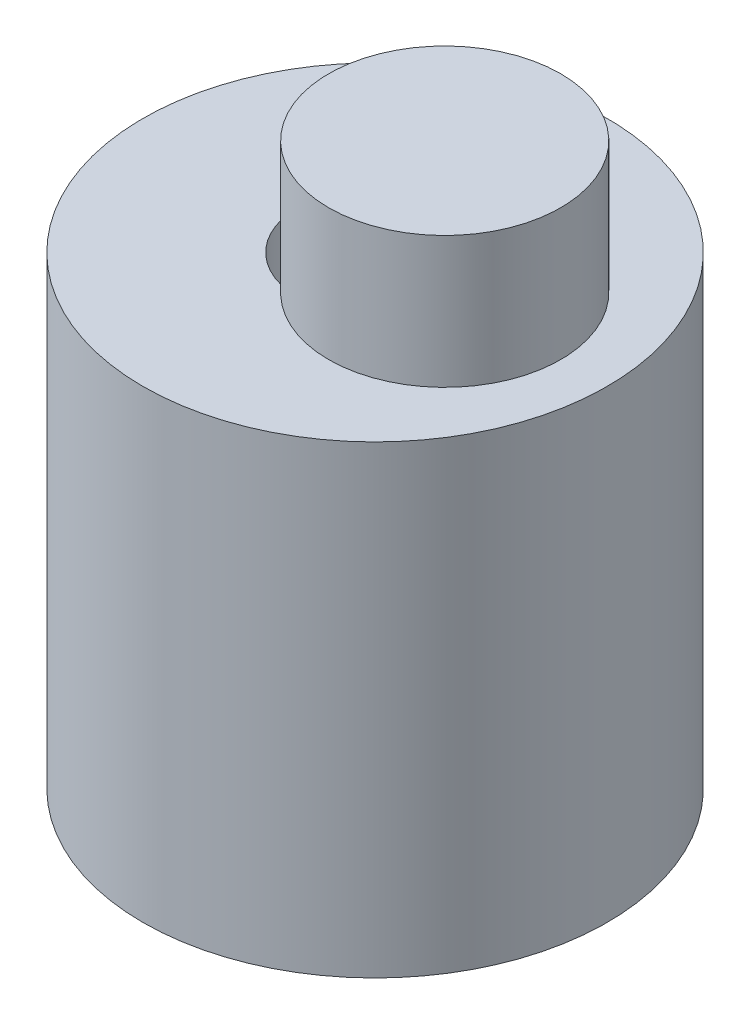
ISO-10303-21;
HEADER;
FILE_DESCRIPTION(('STEP AP214'),'2;1');
FILE_NAME('part.step','',(''),(''),'','','');
FILE_SCHEMA(('AUTOMOTIVE_DESIGN { 1 0 10303 214 1 1 1 1 }'));
ENDSEC;
DATA;
#1=APPLICATION_CONTEXT('core data for automotive mechanical design processes');
#2=APPLICATION_PROTOCOL_DEFINITION('international standard','automotive_design',2000,#1);
#3=PRODUCT_CONTEXT('',#1,'mechanical');
#4=PRODUCT('Part','Part','',(#3));
#5=PRODUCT_RELATED_PRODUCT_CATEGORY('part','',(#4));
#6=PRODUCT_DEFINITION_FORMATION('','',#4);
#7=PRODUCT_DEFINITION_CONTEXT('part definition',#1,'design');
#8=PRODUCT_DEFINITION('design','',#6,#7);
#9=PRODUCT_DEFINITION_SHAPE('','',#8);
#10=(LENGTH_UNIT() NAMED_UNIT(*) SI_UNIT(.MILLI.,.METRE.));
#11=(NAMED_UNIT(*) PLANE_ANGLE_UNIT() SI_UNIT($,.RADIAN.));
#12=(NAMED_UNIT(*) SI_UNIT($,.STERADIAN.) SOLID_ANGLE_UNIT());
#13=UNCERTAINTY_MEASURE_WITH_UNIT(LENGTH_MEASURE(1.E-05),#10,'distance_accuracy_value','');
#14=(GEOMETRIC_REPRESENTATION_CONTEXT(3) GLOBAL_UNCERTAINTY_ASSIGNED_CONTEXT((#13)) GLOBAL_UNIT_ASSIGNED_CONTEXT((#10,
#11,#12)) REPRESENTATION_CONTEXT('',''));
#15=CARTESIAN_POINT('',(0.,0.,0.));
#16=DIRECTION('',(0.,0.,1.));
#17=DIRECTION('',(1.,0.,0.));
#18=AXIS2_PLACEMENT_3D('',#15,#16,#17);
#19=CARTESIAN_POINT('',(0.,6.,0.));
#20=DIRECTION('',(0.,1.,0.));
#21=DIRECTION('',(0.,0.,1.));
#22=AXIS2_PLACEMENT_3D('',#19,#20,#21);
#23=PLANE('',#22);
#24=CARTESIAN_POINT('',(0.9,6.,0.));
#25=DIRECTION('',(0.,1.,0.));
#26=DIRECTION('',(0.,0.,1.));
#27=AXIS2_PLACEMENT_3D('',#24,#25,#26);
#28=CIRCLE('',#27,1.5);
#29=CARTESIAN_POINT('',(-0.244444444444445,6.,0.96966329907873));
#30=VERTEX_POINT('',#29);
#31=CARTESIAN_POINT('',(-0.244444444444445,6.,-0.96966329907873));
#32=VERTEX_POINT('',#31);
#33=EDGE_CURVE('E11',#30,#32,#28,.T.);
#34=ORIENTED_EDGE('',*,*,#33,.F.);
#35=CARTESIAN_POINT('',(0.,6.,0.));
#36=DIRECTION('',(0.,1.,0.));
#37=DIRECTION('',(0.,0.,1.));
#38=AXIS2_PLACEMENT_3D('',#35,#36,#37);
#39=CIRCLE('',#38,1.);
#40=EDGE_CURVE('E49',#32,#30,#39,.T.);
#41=ORIENTED_EDGE('',*,*,#40,.F.);
#42=EDGE_LOOP('',(#34,#41));
#43=FACE_BOUND('',#42,.T.);
#44=CARTESIAN_POINT('',(0.,6.,0.));
#45=DIRECTION('',(0.,1.,0.));
#46=DIRECTION('',(0.,0.,1.));
#47=AXIS2_PLACEMENT_3D('',#44,#45,#46);
#48=CIRCLE('',#47,3.);
#49=CARTESIAN_POINT('',(0.,6.,3.));
#50=VERTEX_POINT('',#49);
#51=EDGE_CURVE('E41',#50,#50,#48,.T.);
#52=ORIENTED_EDGE('',*,*,#51,.T.);
#53=EDGE_LOOP('',(#52));
#54=FACE_BOUND('',#53,.T.);
#55=ADVANCED_FACE('F32',(#43,#54),#23,.T.);
#56=CARTESIAN_POINT('',(0.,0.,0.));
#57=DIRECTION('',(0.,1.,0.));
#58=DIRECTION('',(0.,0.,1.));
#59=AXIS2_PLACEMENT_3D('',#56,#57,#58);
#60=PLANE('',#59);
#61=CARTESIAN_POINT('',(0.,0.,0.));
#62=DIRECTION('',(0.,1.,0.));
#63=DIRECTION('',(0.,0.,1.));
#64=AXIS2_PLACEMENT_3D('',#61,#62,#63);
#65=CIRCLE('',#64,3.);
#66=CARTESIAN_POINT('',(0.,0.,3.));
#67=VERTEX_POINT('',#66);
#68=EDGE_CURVE('E36',#67,#67,#65,.T.);
#69=ORIENTED_EDGE('',*,*,#68,.F.);
#70=EDGE_LOOP('',(#69));
#71=FACE_BOUND('',#70,.T.);
#72=CARTESIAN_POINT('',(0.,0.,0.));
#73=DIRECTION('',(0.,1.,0.));
#74=DIRECTION('',(0.,0.,1.));
#75=AXIS2_PLACEMENT_3D('',#72,#73,#74);
#76=CIRCLE('',#75,1.);
#77=CARTESIAN_POINT('',(0.,0.,1.));
#78=VERTEX_POINT('',#77);
#79=EDGE_CURVE('E61',#78,#78,#76,.T.);
#80=ORIENTED_EDGE('',*,*,#79,.T.);
#81=EDGE_LOOP('',(#80));
#82=FACE_BOUND('',#81,.T.);
#83=ADVANCED_FACE('F76',(#71,#82),#60,.F.);
#84=CARTESIAN_POINT('',(0.,6.,0.));
#85=DIRECTION('',(0.,-1.,0.));
#86=DIRECTION('',(0.,0.,-1.));
#87=AXIS2_PLACEMENT_3D('',#84,#85,#86);
#88=CYLINDRICAL_SURFACE('',#87,3.);
#89=ORIENTED_EDGE('',*,*,#51,.F.);
#90=EDGE_LOOP('',(#89));
#91=FACE_BOUND('',#90,.T.);
#92=ORIENTED_EDGE('',*,*,#68,.T.);
#93=EDGE_LOOP('',(#92));
#94=FACE_BOUND('',#93,.T.);
#95=ADVANCED_FACE('F34',(#91,#94),#88,.T.);
#96=CARTESIAN_POINT('',(0.,6.,0.));
#97=DIRECTION('',(0.,-1.,0.));
#98=DIRECTION('',(0.,0.,-1.));
#99=AXIS2_PLACEMENT_3D('',#96,#97,#98);
#100=CYLINDRICAL_SURFACE('',#99,1.);
#101=ORIENTED_EDGE('',*,*,#40,.T.);
#102=EDGE_CURVE('E54',#30,#32,#39,.T.);
#103=ORIENTED_EDGE('',*,*,#102,.T.);
#104=EDGE_LOOP('',(#101,#103));
#105=FACE_BOUND('',#104,.T.);
#106=ORIENTED_EDGE('',*,*,#79,.F.);
#107=EDGE_LOOP('',(#106));
#108=FACE_BOUND('',#107,.T.);
#109=ADVANCED_FACE('F56',(#105,#108),#100,.F.);
#110=CARTESIAN_POINT('',(0.9,7.7,0.));
#111=DIRECTION('',(0.,-1.,0.));
#112=DIRECTION('',(0.,0.,-1.));
#113=AXIS2_PLACEMENT_3D('',#110,#111,#112);
#114=CYLINDRICAL_SURFACE('',#113,1.5);
#115=CARTESIAN_POINT('',(0.9,7.7,0.));
#116=DIRECTION('',(0.,1.,0.));
#117=DIRECTION('',(0.,0.,1.));
#118=AXIS2_PLACEMENT_3D('',#115,#116,#117);
#119=CIRCLE('',#118,1.5);
#120=CARTESIAN_POINT('',(0.9,7.7,1.5));
#121=VERTEX_POINT('',#120);
#122=EDGE_CURVE('E65',#121,#121,#119,.T.);
#123=ORIENTED_EDGE('',*,*,#122,.F.);
#124=EDGE_LOOP('',(#123));
#125=FACE_BOUND('',#124,.T.);
#126=EDGE_CURVE('E43',#32,#30,#28,.T.);
#127=ORIENTED_EDGE('',*,*,#126,.T.);
#128=ORIENTED_EDGE('',*,*,#33,.T.);
#129=EDGE_LOOP('',(#127,#128));
#130=FACE_BOUND('',#129,.T.);
#131=ADVANCED_FACE('F63',(#125,#130),#114,.T.);
#132=CARTESIAN_POINT('',(0.9,7.7,0.));
#133=DIRECTION('',(0.,1.,0.));
#134=DIRECTION('',(0.,0.,1.));
#135=AXIS2_PLACEMENT_3D('',#132,#133,#134);
#136=PLANE('',#135);
#137=ORIENTED_EDGE('',*,*,#122,.T.);
#138=EDGE_LOOP('',(#137));
#139=FACE_BOUND('',#138,.T.);
#140=ADVANCED_FACE('F86',(#139),#136,.T.);
#141=CARTESIAN_POINT('',(0.9,6.,0.));
#142=DIRECTION('',(0.,1.,0.));
#143=DIRECTION('',(0.,0.,1.));
#144=AXIS2_PLACEMENT_3D('',#141,#142,#143);
#145=PLANE('',#144);
#146=ORIENTED_EDGE('',*,*,#102,.F.);
#147=ORIENTED_EDGE('',*,*,#126,.F.);
#148=EDGE_LOOP('',(#146,#147));
#149=FACE_BOUND('',#148,.T.);
#150=ADVANCED_FACE('F64',(#149),#145,.F.);
#151=CLOSED_SHELL('',(#55,#83,#95,#109,#131,#140,#150));
#152=MANIFOLD_SOLID_BREP('B2',#151);
#153=ADVANCED_BREP_SHAPE_REPRESENTATION('',(#18,#152),#14);
#154=SHAPE_DEFINITION_REPRESENTATION(#9,#153);
ENDSEC;
END-ISO-10303-21;
